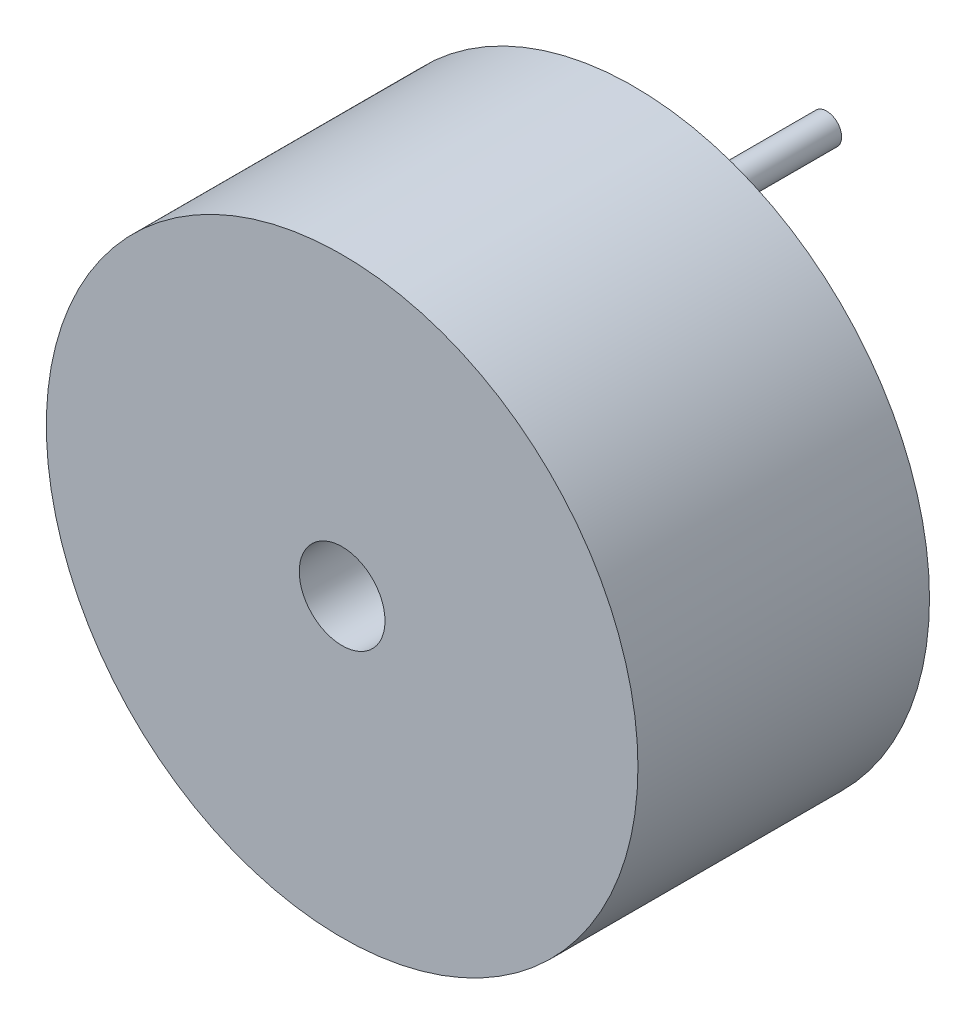
ISO-10303-21;
HEADER;
FILE_DESCRIPTION(('STEP AP214'),'2;1');
FILE_NAME('part.step','',(''),(''),'','','');
FILE_SCHEMA(('AUTOMOTIVE_DESIGN { 1 0 10303 214 1 1 1 1 }'));
ENDSEC;
DATA;
#1=APPLICATION_CONTEXT('core data for automotive mechanical design processes');
#2=APPLICATION_PROTOCOL_DEFINITION('international standard','automotive_design',2000,#1);
#3=PRODUCT_CONTEXT('',#1,'mechanical');
#4=PRODUCT('Part','Part','',(#3));
#5=PRODUCT_RELATED_PRODUCT_CATEGORY('part','',(#4));
#6=PRODUCT_DEFINITION_FORMATION('','',#4);
#7=PRODUCT_DEFINITION_CONTEXT('part definition',#1,'design');
#8=PRODUCT_DEFINITION('design','',#6,#7);
#9=PRODUCT_DEFINITION_SHAPE('','',#8);
#10=(LENGTH_UNIT() NAMED_UNIT(*) SI_UNIT(.MILLI.,.METRE.));
#11=(NAMED_UNIT(*) PLANE_ANGLE_UNIT() SI_UNIT($,.RADIAN.));
#12=(NAMED_UNIT(*) SI_UNIT($,.STERADIAN.) SOLID_ANGLE_UNIT());
#13=UNCERTAINTY_MEASURE_WITH_UNIT(LENGTH_MEASURE(1.E-05),#10,'distance_accuracy_value','');
#14=(GEOMETRIC_REPRESENTATION_CONTEXT(3) GLOBAL_UNCERTAINTY_ASSIGNED_CONTEXT((#13)) GLOBAL_UNIT_ASSIGNED_CONTEXT((#10,
#11,#12)) REPRESENTATION_CONTEXT('',''));
#15=CARTESIAN_POINT('',(0.,0.,0.));
#16=DIRECTION('',(0.,0.,1.));
#17=DIRECTION('',(1.,0.,0.));
#18=AXIS2_PLACEMENT_3D('',#15,#16,#17);
#19=CARTESIAN_POINT('',(0.,0.,6.8));
#20=DIRECTION('',(0.,0.,-1.));
#21=DIRECTION('',(-1.,0.,0.));
#22=AXIS2_PLACEMENT_3D('',#19,#20,#21);
#23=CYLINDRICAL_SURFACE('',#22,6.9);
#24=CARTESIAN_POINT('',(0.,0.,6.8));
#25=DIRECTION('',(0.,0.,1.));
#26=DIRECTION('',(1.,0.,0.));
#27=AXIS2_PLACEMENT_3D('',#24,#25,#26);
#28=CIRCLE('',#27,6.9);
#29=CARTESIAN_POINT('',(6.9,0.,6.8));
#30=VERTEX_POINT('',#29);
#31=EDGE_CURVE('E43',#30,#30,#28,.T.);
#32=ORIENTED_EDGE('',*,*,#31,.F.);
#33=EDGE_LOOP('',(#32));
#34=FACE_BOUND('',#33,.T.);
#35=CARTESIAN_POINT('',(0.,0.,0.));
#36=DIRECTION('',(0.,0.,1.));
#37=DIRECTION('',(1.,0.,0.));
#38=AXIS2_PLACEMENT_3D('',#35,#36,#37);
#39=CIRCLE('',#38,6.9);
#40=CARTESIAN_POINT('',(6.9,0.,0.));
#41=VERTEX_POINT('',#40);
#42=EDGE_CURVE('E47',#41,#41,#39,.T.);
#43=ORIENTED_EDGE('',*,*,#42,.T.);
#44=EDGE_LOOP('',(#43));
#45=FACE_BOUND('',#44,.T.);
#46=ADVANCED_FACE('F33',(#34,#45),#23,.T.);
#47=CARTESIAN_POINT('',(0.,0.,6.8));
#48=DIRECTION('',(0.,0.,1.));
#49=DIRECTION('',(1.,0.,0.));
#50=AXIS2_PLACEMENT_3D('',#47,#48,#49);
#51=PLANE('',#50);
#52=CARTESIAN_POINT('',(0.,0.,6.8));
#53=DIRECTION('',(0.,0.,1.));
#54=DIRECTION('',(1.,0.,0.));
#55=AXIS2_PLACEMENT_3D('',#52,#53,#54);
#56=CIRCLE('',#55,1.);
#57=CARTESIAN_POINT('',(1.,0.,6.8));
#58=VERTEX_POINT('',#57);
#59=EDGE_CURVE('E59',#58,#58,#56,.T.);
#60=ORIENTED_EDGE('',*,*,#59,.F.);
#61=EDGE_LOOP('',(#60));
#62=FACE_BOUND('',#61,.T.);
#63=ORIENTED_EDGE('',*,*,#31,.T.);
#64=EDGE_LOOP('',(#63));
#65=FACE_BOUND('',#64,.T.);
#66=ADVANCED_FACE('F74',(#62,#65),#51,.T.);
#67=CARTESIAN_POINT('',(0.,0.,0.));
#68=DIRECTION('',(0.,0.,1.));
#69=DIRECTION('',(1.,0.,0.));
#70=AXIS2_PLACEMENT_3D('',#67,#68,#69);
#71=PLANE('',#70);
#72=CARTESIAN_POINT('',(0.,-3.8,0.));
#73=DIRECTION('',(0.,0.,1.));
#74=DIRECTION('',(1.,0.,0.));
#75=AXIS2_PLACEMENT_3D('',#72,#73,#74);
#76=CIRCLE('',#75,0.35);
#77=CARTESIAN_POINT('',(0.35,-3.8,0.));
#78=VERTEX_POINT('',#77);
#79=EDGE_CURVE('E10',#78,#78,#76,.F.);
#80=ORIENTED_EDGE('',*,*,#79,.F.);
#81=EDGE_LOOP('',(#80));
#82=FACE_BOUND('',#81,.T.);
#83=CARTESIAN_POINT('',(0.,3.8,0.));
#84=DIRECTION('',(0.,0.,1.));
#85=DIRECTION('',(1.,0.,0.));
#86=AXIS2_PLACEMENT_3D('',#83,#84,#85);
#87=CIRCLE('',#86,0.35);
#88=CARTESIAN_POINT('',(0.35,3.8,0.));
#89=VERTEX_POINT('',#88);
#90=EDGE_CURVE('E39',#89,#89,#87,.F.);
#91=ORIENTED_EDGE('',*,*,#90,.F.);
#92=EDGE_LOOP('',(#91));
#93=FACE_BOUND('',#92,.T.);
#94=ORIENTED_EDGE('',*,*,#42,.F.);
#95=EDGE_LOOP('',(#94));
#96=FACE_BOUND('',#95,.T.);
#97=ADVANCED_FACE('F77',(#82,#93,#96),#71,.F.);
#98=CARTESIAN_POINT('',(0.,3.8,-4.5));
#99=DIRECTION('',(0.,0.,1.));
#100=DIRECTION('',(1.,0.,0.));
#101=AXIS2_PLACEMENT_3D('',#98,#99,#100);
#102=CYLINDRICAL_SURFACE('',#101,0.35);
#103=CARTESIAN_POINT('',(0.,3.8,-4.5));
#104=DIRECTION('',(0.,0.,-1.));
#105=DIRECTION('',(-1.,0.,0.));
#106=AXIS2_PLACEMENT_3D('',#103,#104,#105);
#107=CIRCLE('',#106,0.35);
#108=CARTESIAN_POINT('',(-0.35,3.8,-4.5));
#109=VERTEX_POINT('',#108);
#110=EDGE_CURVE('E51',#109,#109,#107,.T.);
#111=ORIENTED_EDGE('',*,*,#110,.F.);
#112=EDGE_LOOP('',(#111));
#113=FACE_BOUND('',#112,.T.);
#114=ORIENTED_EDGE('',*,*,#90,.T.);
#115=EDGE_LOOP('',(#114));
#116=FACE_BOUND('',#115,.T.);
#117=ADVANCED_FACE('F86',(#113,#116),#102,.T.);
#118=CARTESIAN_POINT('',(0.,3.8,-4.5));
#119=DIRECTION('',(0.,0.,-1.));
#120=DIRECTION('',(-1.,0.,0.));
#121=AXIS2_PLACEMENT_3D('',#118,#119,#120);
#122=PLANE('',#121);
#123=ORIENTED_EDGE('',*,*,#110,.T.);
#124=EDGE_LOOP('',(#123));
#125=FACE_BOUND('',#124,.T.);
#126=ADVANCED_FACE('F91',(#125),#122,.T.);
#127=CARTESIAN_POINT('',(0.,-3.8,-4.5));
#128=DIRECTION('',(0.,0.,1.));
#129=DIRECTION('',(1.,0.,0.));
#130=AXIS2_PLACEMENT_3D('',#127,#128,#129);
#131=CYLINDRICAL_SURFACE('',#130,0.35);
#132=CARTESIAN_POINT('',(0.,-3.8,-4.5));
#133=DIRECTION('',(0.,0.,-1.));
#134=DIRECTION('',(-1.,0.,0.));
#135=AXIS2_PLACEMENT_3D('',#132,#133,#134);
#136=CIRCLE('',#135,0.35);
#137=CARTESIAN_POINT('',(-0.35,-3.8,-4.5));
#138=VERTEX_POINT('',#137);
#139=EDGE_CURVE('E55',#138,#138,#136,.T.);
#140=ORIENTED_EDGE('',*,*,#139,.F.);
#141=EDGE_LOOP('',(#140));
#142=FACE_BOUND('',#141,.T.);
#143=ORIENTED_EDGE('',*,*,#79,.T.);
#144=EDGE_LOOP('',(#143));
#145=FACE_BOUND('',#144,.T.);
#146=ADVANCED_FACE('F98',(#142,#145),#131,.T.);
#147=CARTESIAN_POINT('',(0.,-3.8,-4.5));
#148=DIRECTION('',(0.,0.,-1.));
#149=DIRECTION('',(-1.,0.,0.));
#150=AXIS2_PLACEMENT_3D('',#147,#148,#149);
#151=PLANE('',#150);
#152=ORIENTED_EDGE('',*,*,#139,.T.);
#153=EDGE_LOOP('',(#152));
#154=FACE_BOUND('',#153,.T.);
#155=ADVANCED_FACE('F70',(#154),#151,.T.);
#156=CARTESIAN_POINT('',(0.,0.,2.3));
#157=DIRECTION('',(0.,0.,1.));
#158=DIRECTION('',(1.,0.,0.));
#159=AXIS2_PLACEMENT_3D('',#156,#157,#158);
#160=CYLINDRICAL_SURFACE('',#159,1.);
#161=CARTESIAN_POINT('',(0.,0.,2.3));
#162=DIRECTION('',(0.,0.,1.));
#163=DIRECTION('',(1.,0.,0.));
#164=AXIS2_PLACEMENT_3D('',#161,#162,#163);
#165=CIRCLE('',#164,1.);
#166=CARTESIAN_POINT('',(1.,0.,2.3));
#167=VERTEX_POINT('',#166);
#168=EDGE_CURVE('E58',#167,#167,#165,.T.);
#169=ORIENTED_EDGE('',*,*,#168,.F.);
#170=EDGE_LOOP('',(#169));
#171=FACE_BOUND('',#170,.T.);
#172=ORIENTED_EDGE('',*,*,#59,.T.);
#173=EDGE_LOOP('',(#172));
#174=FACE_BOUND('',#173,.T.);
#175=ADVANCED_FACE('F67',(#171,#174),#160,.F.);
#176=CARTESIAN_POINT('',(0.,0.,2.3));
#177=DIRECTION('',(0.,0.,1.));
#178=DIRECTION('',(1.,0.,0.));
#179=AXIS2_PLACEMENT_3D('',#176,#177,#178);
#180=PLANE('',#179);
#181=ORIENTED_EDGE('',*,*,#168,.T.);
#182=EDGE_LOOP('',(#181));
#183=FACE_BOUND('',#182,.T.);
#184=ADVANCED_FACE('F65',(#183),#180,.T.);
#185=CLOSED_SHELL('',(#46,#66,#97,#117,#126,#146,#155,#175,#184));
#186=MANIFOLD_SOLID_BREP('B2',#185);
#187=ADVANCED_BREP_SHAPE_REPRESENTATION('',(#18,#186),#14);
#188=SHAPE_DEFINITION_REPRESENTATION(#9,#187);
ENDSEC;
END-ISO-10303-21;
